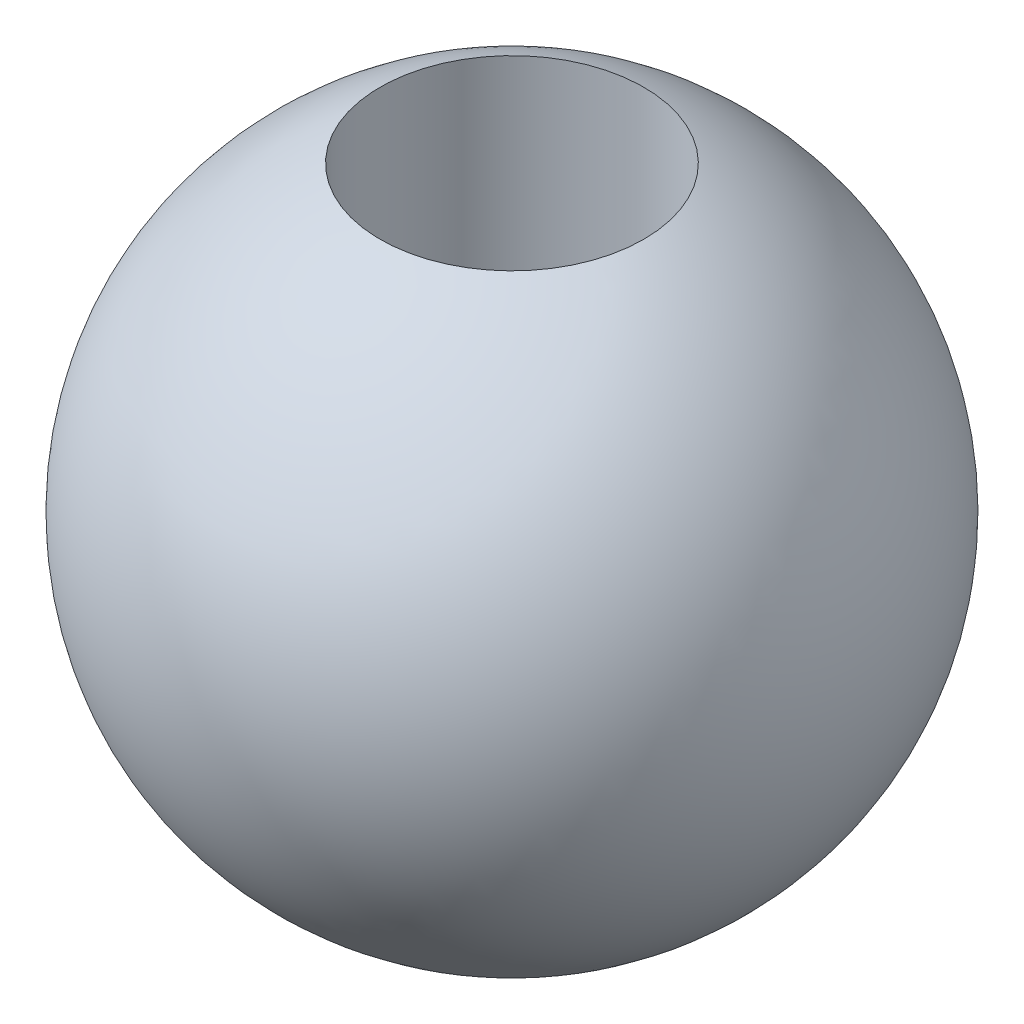
ISO-10303-21;
HEADER;
FILE_DESCRIPTION(('STEP AP214'),'2;1');
FILE_NAME('part.step','',(''),(''),'','','');
FILE_SCHEMA(('AUTOMOTIVE_DESIGN { 1 0 10303 214 1 1 1 1 }'));
ENDSEC;
DATA;
#1=APPLICATION_CONTEXT('core data for automotive mechanical design processes');
#2=APPLICATION_PROTOCOL_DEFINITION('international standard','automotive_design',2000,#1);
#3=PRODUCT_CONTEXT('',#1,'mechanical');
#4=PRODUCT('Part','Part','',(#3));
#5=PRODUCT_RELATED_PRODUCT_CATEGORY('part','',(#4));
#6=PRODUCT_DEFINITION_FORMATION('','',#4);
#7=PRODUCT_DEFINITION_CONTEXT('part definition',#1,'design');
#8=PRODUCT_DEFINITION('design','',#6,#7);
#9=PRODUCT_DEFINITION_SHAPE('','',#8);
#10=(LENGTH_UNIT() NAMED_UNIT(*) SI_UNIT(.MILLI.,.METRE.));
#11=(NAMED_UNIT(*) PLANE_ANGLE_UNIT() SI_UNIT($,.RADIAN.));
#12=(NAMED_UNIT(*) SI_UNIT($,.STERADIAN.) SOLID_ANGLE_UNIT());
#13=UNCERTAINTY_MEASURE_WITH_UNIT(LENGTH_MEASURE(1.E-05),#10,'distance_accuracy_value','');
#14=(GEOMETRIC_REPRESENTATION_CONTEXT(3) GLOBAL_UNCERTAINTY_ASSIGNED_CONTEXT((#13)) GLOBAL_UNIT_ASSIGNED_CONTEXT((#10,
#11,#12)) REPRESENTATION_CONTEXT('',''));
#15=CARTESIAN_POINT('',(0.,0.,0.));
#16=DIRECTION('',(0.,0.,1.));
#17=DIRECTION('',(1.,0.,0.));
#18=AXIS2_PLACEMENT_3D('',#15,#16,#17);
#19=CARTESIAN_POINT('',(0.,0.,0.));
#20=DIRECTION('',(0.,-1.,0.));
#21=DIRECTION('',(1.,0.,0.));
#22=AXIS2_PLACEMENT_3D('',#19,#20,#21);
#23=SPHERICAL_SURFACE('',#22,2.5);
#24=CARTESIAN_POINT('',(0.,2.29128784747792,0.));
#25=DIRECTION('',(0.,-1.,0.));
#26=DIRECTION('',(0.,0.,-1.));
#27=AXIS2_PLACEMENT_3D('',#24,#25,#26);
#28=CIRCLE('',#27,1.);
#29=CARTESIAN_POINT('',(0.999999999999999,2.29128784747792,0.));
#30=VERTEX_POINT('',#29);
#31=EDGE_CURVE('E10',#30,#30,#28,.T.);
#32=CARTESIAN_POINT('',(0.,-2.29128784747792,0.));
#33=DIRECTION('',(0.,1.,0.));
#34=DIRECTION('',(0.,0.,1.));
#35=AXIS2_PLACEMENT_3D('',#32,#33,#34);
#36=CIRCLE('',#35,1.);
#37=CARTESIAN_POINT('',(0.999999999999999,-2.29128784747792,0.));
#38=VERTEX_POINT('',#37);
#39=EDGE_CURVE('E47',#38,#38,#36,.T.);
#40=CARTESIAN_POINT('',(0.999999999999999,2.29128784747792,0.));
#41=CARTESIAN_POINT('',(1.05534030585969,2.26713984552259,0.));
#42=CARTESIAN_POINT('',(1.1098019517085,2.24097987322675,0.));
#43=CARTESIAN_POINT('',(1.21669056048761,2.18478927921392,0.));
#44=CARTESIAN_POINT('',(1.26911752341793,2.15475865749693,0.));
#45=CARTESIAN_POINT('',(1.37165940346336,2.09098005590165,0.));
#46=CARTESIAN_POINT('',(1.42177432057847,2.05723207602337,0.));
#47=CARTESIAN_POINT('',(1.51942973923918,1.98619699822935,0.));
#48=CARTESIAN_POINT('',(1.56697024078477,1.94890990031363,0.));
#49=CARTESIAN_POINT('',(1.65922720104435,1.87099193956855,0.));
#50=CARTESIAN_POINT('',(1.70394365975834,1.83036107673919,0.));
#51=CARTESIAN_POINT('',(1.79031793144863,1.74596887618961,0.));
#52=CARTESIAN_POINT('',(1.83197574442494,1.70220753846939,0.));
#53=CARTESIAN_POINT('',(1.9120141167145,1.61178400039807,0.));
#54=CARTESIAN_POINT('',(1.95039467602776,1.56512180004697,0.));
#55=CARTESIAN_POINT('',(2.02367714495927,1.46914139908999,0.));
#56=CARTESIAN_POINT('',(2.05857905457754,1.41982319848411,0.));
#57=CARTESIAN_POINT('',(2.12472107809284,1.31878958904172,0.));
#58=CARTESIAN_POINT('',(2.15596119198988,1.2670741802052,0.));
#59=CARTESIAN_POINT('',(2.21461569409772,1.16151752751284,0.));
#60=CARTESIAN_POINT('',(2.24203008230852,1.10767628365699,0.));
#61=CARTESIAN_POINT('',(2.29288927800792,0.998150488759765,0.));
#62=CARTESIAN_POINT('',(2.31633408549652,0.942465937718377,0.));
#63=CARTESIAN_POINT('',(2.35913109487308,0.82954572904666,0.));
#64=CARTESIAN_POINT('',(2.37848329676103,0.772310071416331,0.));
#65=CARTESIAN_POINT('',(2.41299354568285,0.656587989441777,0.));
#66=CARTESIAN_POINT('',(2.42815159271671,0.598101565097551,0.));
#67=CARTESIAN_POINT('',(2.45419399120001,0.480184852886519,0.));
#68=CARTESIAN_POINT('',(2.46507834264944,0.420754565019713,0.));
#69=CARTESIAN_POINT('',(2.48251623513376,0.301261981806128,0.));
#70=CARTESIAN_POINT('',(2.48906977616866,0.24119968645935,0.));
#71=CARTESIAN_POINT('',(2.49781165860178,0.120758260741715,0.));
#72=CARTESIAN_POINT('',(2.5,0.0603791303708578,0.));
#73=CARTESIAN_POINT('',(2.5,-0.0603791303708562,0.));
#74=CARTESIAN_POINT('',(2.49781165860178,-0.120758260741713,0.));
#75=CARTESIAN_POINT('',(2.48906977616866,-0.241199686459348,0.));
#76=CARTESIAN_POINT('',(2.48251623513376,-0.301261981806126,0.));
#77=CARTESIAN_POINT('',(2.46507834264944,-0.420754565019711,0.));
#78=CARTESIAN_POINT('',(2.45419399120001,-0.480184852886518,0.));
#79=CARTESIAN_POINT('',(2.42815159271671,-0.59810156509755,0.));
#80=CARTESIAN_POINT('',(2.41299354568285,-0.656587989441775,0.));
#81=CARTESIAN_POINT('',(2.37848329676103,-0.772310071416329,0.));
#82=CARTESIAN_POINT('',(2.35913109487308,-0.829545729046658,0.));
#83=CARTESIAN_POINT('',(2.31633408549653,-0.942465937718376,0.));
#84=CARTESIAN_POINT('',(2.29288927800792,-0.998150488759764,0.));
#85=CARTESIAN_POINT('',(2.24203008230852,-1.10767628365699,0.));
#86=CARTESIAN_POINT('',(2.21461569409772,-1.16151752751283,0.));
#87=CARTESIAN_POINT('',(2.15596119198988,-1.2670741802052,0.));
#88=CARTESIAN_POINT('',(2.12472107809284,-1.31878958904172,0.));
#89=CARTESIAN_POINT('',(2.05857905457754,-1.41982319848411,0.));
#90=CARTESIAN_POINT('',(2.02367714495927,-1.46914139908999,0.));
#91=CARTESIAN_POINT('',(1.95039467602776,-1.56512180004696,0.));
#92=CARTESIAN_POINT('',(1.9120141167145,-1.61178400039806,0.));
#93=CARTESIAN_POINT('',(1.83197574442494,-1.70220753846939,0.));
#94=CARTESIAN_POINT('',(1.79031793144863,-1.74596887618961,0.));
#95=CARTESIAN_POINT('',(1.70394365975834,-1.83036107673919,0.));
#96=CARTESIAN_POINT('',(1.65922720104435,-1.87099193956854,0.));
#97=CARTESIAN_POINT('',(1.56697024078477,-1.94890990031363,0.));
#98=CARTESIAN_POINT('',(1.51942973923918,-1.98619699822935,0.));
#99=CARTESIAN_POINT('',(1.42177432057847,-2.05723207602337,0.));
#100=CARTESIAN_POINT('',(1.37165940346335,-2.09098005590165,0.));
#101=CARTESIAN_POINT('',(1.26911752341793,-2.15475865749693,0.));
#102=CARTESIAN_POINT('',(1.21669056048761,-2.18478927921392,0.));
#103=CARTESIAN_POINT('',(1.1098019517085,-2.24097987322675,0.));
#104=CARTESIAN_POINT('',(1.05534030585969,-2.26713984552259,0.));
#105=CARTESIAN_POINT('',(0.999999999999999,-2.29128784747792,0.));
#106=B_SPLINE_CURVE_WITH_KNOTS('',3,(#40,#41,#42,#43,#44,#45,#46,#47,#48,#49,#50,#51,#52,#53,
#54,#55,#56,#57,#58,#59,#60,#61,#62,#63,#64,#65,#66,#67,#68,#69,#70,#71,#72,#73,#74,#75,#76,#77,
#78,#79,#80,#81,#82,#83,#84,#85,#86,#87,#88,#89,#90,#91,#92,#93,#94,#95,#96,#97,#98,#99,#100,
#101,#102,#103,#104,#105),.UNSPECIFIED.,.F.,.F.,(4,2,2,2,2,2,2,2,2,2,2,2,2,2,2,2,2,2,2,2,2,2,2,
2,2,2,2,2,2,2,2,2,4),(0.,0.181097799748982,0.362195599497965,0.543293399246947,
0.724391198995929,0.905488998744911,1.08658679849389,1.26768459824288,1.44878239799186,
1.62988019774084,1.81097799748982,1.9920757972388,2.17317359698779,2.35427139673677,
2.53536919648575,2.71646699623473,2.89756479598372,3.0786625957327,3.25976039548168,
3.44085819523066,3.62195599497964,3.80305379472863,3.98415159447761,4.16524939422659,
4.34634719397557,4.52744499372456,4.70854279347354,4.88964059322252,5.0707383929715,
5.25183619272048,5.43293399246947,5.61403179221845,5.79512959196743),.UNSPECIFIED.);
#107=EDGE_CURVE('BSEAM41',#30,#38,#106,.T.);
#108=ORIENTED_EDGE('',*,*,#31,.T.);
#109=ORIENTED_EDGE('',*,*,#39,.T.);
#110=ORIENTED_EDGE('',*,*,#107,.T.);
#111=ORIENTED_EDGE('',*,*,#107,.F.);
#112=EDGE_LOOP('',(#108,#110,#109,#111));
#113=FACE_BOUND('',#112,.T.);
#114=ADVANCED_FACE('F41',(#113),#23,.T.);
#115=CARTESIAN_POINT('',(0.,-5.,0.));
#116=DIRECTION('',(0.,1.,0.));
#117=DIRECTION('',(0.,0.,1.));
#118=AXIS2_PLACEMENT_3D('',#115,#116,#117);
#119=CYLINDRICAL_SURFACE('',#118,1.);
#120=ORIENTED_EDGE('',*,*,#39,.F.);
#121=EDGE_LOOP('',(#120));
#122=FACE_BOUND('',#121,.T.);
#123=ORIENTED_EDGE('',*,*,#31,.F.);
#124=EDGE_LOOP('',(#123));
#125=FACE_BOUND('',#124,.T.);
#126=ADVANCED_FACE('F54',(#122,#125),#119,.F.);
#127=CLOSED_SHELL('',(#114,#126));
#128=MANIFOLD_SOLID_BREP('B2',#127);
#129=ADVANCED_BREP_SHAPE_REPRESENTATION('',(#18,#128),#14);
#130=SHAPE_DEFINITION_REPRESENTATION(#9,#129);
ENDSEC;
END-ISO-10303-21;
